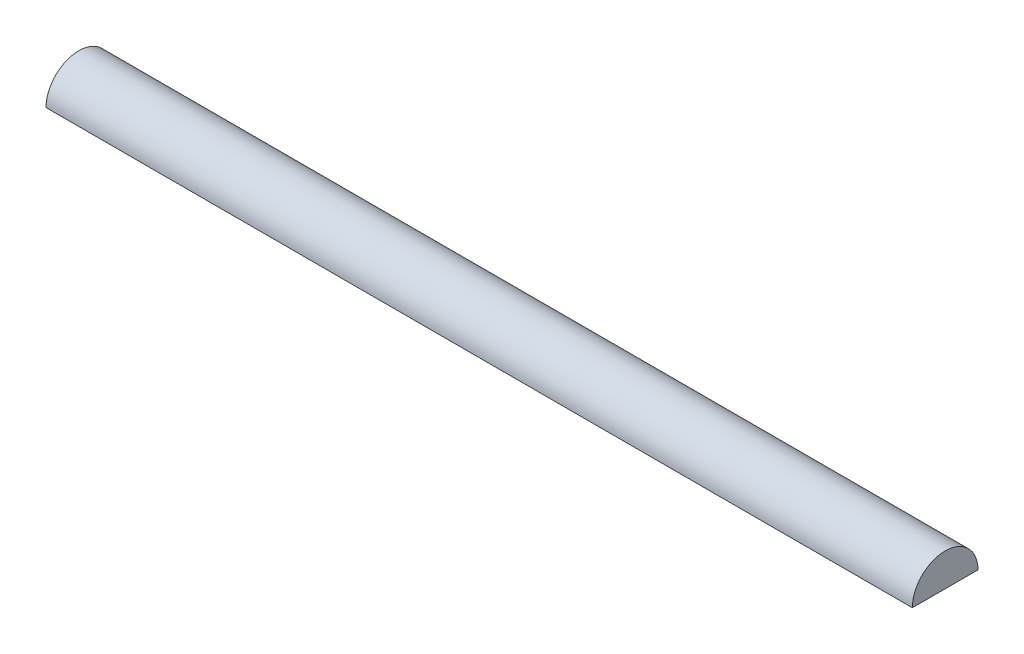
ISO-10303-21;
HEADER;
FILE_DESCRIPTION(('STEP AP214'),'2;1');
FILE_NAME('part.step','',(''),(''),'','','');
FILE_SCHEMA(('AUTOMOTIVE_DESIGN { 1 0 10303 214 1 1 1 1 }'));
ENDSEC;
DATA;
#1=APPLICATION_CONTEXT('core data for automotive mechanical design processes');
#2=APPLICATION_PROTOCOL_DEFINITION('international standard','automotive_design',2000,#1);
#3=PRODUCT_CONTEXT('',#1,'mechanical');
#4=PRODUCT('Part','Part','',(#3));
#5=PRODUCT_RELATED_PRODUCT_CATEGORY('part','',(#4));
#6=PRODUCT_DEFINITION_FORMATION('','',#4);
#7=PRODUCT_DEFINITION_CONTEXT('part definition',#1,'design');
#8=PRODUCT_DEFINITION('design','',#6,#7);
#9=PRODUCT_DEFINITION_SHAPE('','',#8);
#10=(LENGTH_UNIT() NAMED_UNIT(*) SI_UNIT(.MILLI.,.METRE.));
#11=(NAMED_UNIT(*) PLANE_ANGLE_UNIT() SI_UNIT($,.RADIAN.));
#12=(NAMED_UNIT(*) SI_UNIT($,.STERADIAN.) SOLID_ANGLE_UNIT());
#13=UNCERTAINTY_MEASURE_WITH_UNIT(LENGTH_MEASURE(1.E-05),#10,'distance_accuracy_value','');
#14=(GEOMETRIC_REPRESENTATION_CONTEXT(3) GLOBAL_UNCERTAINTY_ASSIGNED_CONTEXT((#13)) GLOBAL_UNIT_ASSIGNED_CONTEXT((#10,
#11,#12)) REPRESENTATION_CONTEXT('',''));
#15=CARTESIAN_POINT('',(0.,0.,0.));
#16=DIRECTION('',(0.,0.,1.));
#17=DIRECTION('',(1.,0.,0.));
#18=AXIS2_PLACEMENT_3D('',#15,#16,#17);
#19=CARTESIAN_POINT('',(-2679.16198120751,0.,0.));
#20=DIRECTION('',(1.,0.,0.));
#21=DIRECTION('',(0.,0.,-1.));
#22=AXIS2_PLACEMENT_3D('',#19,#20,#21);
#23=CYLINDRICAL_SURFACE('',#22,619.375942876971);
#24=DIRECTION('',(1.,0.,0.));
#25=VECTOR('',#24,1.);
#26=CARTESIAN_POINT('',(-2679.16198120751,0.,619.375942876971));
#27=LINE('',#26,#25);
#28=CARTESIAN_POINT('',(-6405.60888402492,0.,619.375942876972));
#29=VERTEX_POINT('',#28);
#30=CARTESIAN_POINT('',(-2668.01604934122,0.,619.375942876971));
#31=VERTEX_POINT('',#30);
#32=EDGE_CURVE('E156',#29,#31,#27,.T.);
#33=ORIENTED_EDGE('',*,*,#32,.F.);
#34=CARTESIAN_POINT('',(-6405.60888402492,0.,0.));
#35=DIRECTION('',(1.,0.,0.));
#36=DIRECTION('',(0.,0.,-1.));
#37=AXIS2_PLACEMENT_3D('',#34,#35,#36);
#38=CIRCLE('',#37,619.375942876972);
#39=CARTESIAN_POINT('',(-6405.60888402492,0.,-619.375942876972));
#40=VERTEX_POINT('',#39);
#41=EDGE_CURVE('E117',#40,#29,#38,.T.);
#42=ORIENTED_EDGE('',*,*,#41,.F.);
#43=DIRECTION('',(1.,0.,0.));
#44=VECTOR('',#43,1.);
#45=CARTESIAN_POINT('',(-2679.16198120751,0.,-619.375942876971));
#46=LINE('',#45,#44);
#47=CARTESIAN_POINT('',(-2668.01604934122,0.,-619.375942876971));
#48=VERTEX_POINT('',#47);
#49=EDGE_CURVE('E58',#48,#40,#46,.F.);
#50=ORIENTED_EDGE('',*,*,#49,.F.);
#51=CARTESIAN_POINT('',(-2668.01604934122,0.,0.));
#52=DIRECTION('',(1.,0.,0.));
#53=DIRECTION('',(0.,0.,-1.));
#54=AXIS2_PLACEMENT_3D('',#51,#52,#53);
#55=CIRCLE('',#54,619.375942876971);
#56=EDGE_CURVE('E130',#48,#31,#55,.T.);
#57=ORIENTED_EDGE('',*,*,#56,.T.);
#58=EDGE_LOOP('',(#33,#42,#50,#57));
#59=FACE_BOUND('',#58,.T.);
#60=ADVANCED_FACE('F35',(#59),#23,.F.);
#61=CARTESIAN_POINT('',(-2668.01604934122,0.,0.));
#62=DIRECTION('',(-1.,0.,0.));
#63=DIRECTION('',(0.,0.,1.));
#64=AXIS2_PLACEMENT_3D('',#61,#62,#63);
#65=CONICAL_SURFACE('',#64,619.375942876971,0.454109682678018);
#66=DIRECTION('',(-0.898651933027225,0.,-0.438662402385287));
#67=VECTOR('',#66,1.);
#68=CARTESIAN_POINT('',(-1399.15100572147,0.,0.));
#69=LINE('',#68,#67);
#70=CARTESIAN_POINT('',(-1757.1850452458,0.,-174.768523987243));
#71=VERTEX_POINT('',#70);
#72=EDGE_CURVE('E160',#71,#48,#69,.T.);
#73=ORIENTED_EDGE('',*,*,#72,.F.);
#74=CARTESIAN_POINT('',(-1757.1850452458,0.,0.));
#75=DIRECTION('',(1.,0.,0.));
#76=DIRECTION('',(0.,0.,-1.));
#77=AXIS2_PLACEMENT_3D('',#74,#75,#76);
#78=CIRCLE('',#77,174.768523987243);
#79=CARTESIAN_POINT('',(-1757.1850452458,0.,174.768523987243));
#80=VERTEX_POINT('',#79);
#81=EDGE_CURVE('E127',#71,#80,#78,.T.);
#82=ORIENTED_EDGE('',*,*,#81,.T.);
#83=DIRECTION('',(0.898651933027225,0.,-0.438662402385287));
#84=VECTOR('',#83,1.);
#85=CARTESIAN_POINT('',(-1399.15100572147,0.,0.));
#86=LINE('',#85,#84);
#87=EDGE_CURVE('E150',#31,#80,#86,.T.);
#88=ORIENTED_EDGE('',*,*,#87,.F.);
#89=ORIENTED_EDGE('',*,*,#56,.F.);
#90=EDGE_LOOP('',(#73,#82,#88,#89));
#91=FACE_BOUND('',#90,.T.);
#92=ADVANCED_FACE('F179',(#91),#65,.F.);
#93=CARTESIAN_POINT('',(-1757.1850452458,0.,0.));
#94=DIRECTION('',(-1.,0.,0.));
#95=DIRECTION('',(0.,0.,1.));
#96=AXIS2_PLACEMENT_3D('',#93,#94,#95);
#97=CONICAL_SURFACE('',#96,174.768523987243,0.18782042016647);
#98=DIRECTION('',(-0.982413535292082,0.,-0.186718091450492));
#99=VECTOR('',#98,1.);
#100=CARTESIAN_POINT('',(-837.643922185361,0.,0.));
#101=LINE('',#100,#99);
#102=CARTESIAN_POINT('',(-2679.16198120751,0.,-350.));
#103=VERTEX_POINT('',#102);
#104=EDGE_CURVE('E158',#103,#71,#101,.F.);
#105=ORIENTED_EDGE('',*,*,#104,.F.);
#106=CARTESIAN_POINT('',(-2679.16198120751,0.,0.));
#107=DIRECTION('',(1.,0.,0.));
#108=DIRECTION('',(0.,0.,-1.));
#109=AXIS2_PLACEMENT_3D('',#106,#107,#108);
#110=CIRCLE('',#109,350.);
#111=CARTESIAN_POINT('',(-2679.16198120751,0.,350.));
#112=VERTEX_POINT('',#111);
#113=EDGE_CURVE('E119',#103,#112,#110,.T.);
#114=ORIENTED_EDGE('',*,*,#113,.T.);
#115=DIRECTION('',(0.982413535292082,0.,-0.186718091450492));
#116=VECTOR('',#115,1.);
#117=CARTESIAN_POINT('',(-837.643922185361,0.,0.));
#118=LINE('',#117,#116);
#119=EDGE_CURVE('E152',#80,#112,#118,.F.);
#120=ORIENTED_EDGE('',*,*,#119,.F.);
#121=ORIENTED_EDGE('',*,*,#81,.F.);
#122=EDGE_LOOP('',(#105,#114,#120,#121));
#123=FACE_BOUND('',#122,.T.);
#124=ADVANCED_FACE('F175',(#123),#97,.T.);
#125=CARTESIAN_POINT('',(-2679.16198120751,0.,350.));
#126=DIRECTION('',(-1.,0.,0.));
#127=DIRECTION('',(0.,0.,1.));
#128=AXIS2_PLACEMENT_3D('',#125,#126,#127);
#129=PLANE('',#128);
#130=DIRECTION('',(0.,0.,-1.));
#131=VECTOR('',#130,1.);
#132=CARTESIAN_POINT('',(-2679.16198120751,0.,350.));
#133=LINE('',#132,#131);
#134=EDGE_CURVE('E154',#112,#103,#133,.T.);
#135=ORIENTED_EDGE('',*,*,#134,.F.);
#136=ORIENTED_EDGE('',*,*,#113,.F.);
#137=EDGE_LOOP('',(#135,#136));
#138=FACE_BOUND('',#137,.T.);
#139=ADVANCED_FACE('F168',(#138),#129,.T.);
#140=CARTESIAN_POINT('',(-5679.16198120751,0.,0.));
#141=DIRECTION('',(1.,0.,0.));
#142=DIRECTION('',(0.,0.,-1.));
#143=AXIS2_PLACEMENT_3D('',#140,#141,#142);
#144=PLANE('',#143);
#145=DIRECTION('',(0.,0.,1.));
#146=VECTOR('',#145,1.);
#147=CARTESIAN_POINT('',(-5679.16198120751,0.,0.));
#148=LINE('',#147,#146);
#149=CARTESIAN_POINT('',(-5679.16198120751,0.,-497.012889954442));
#150=VERTEX_POINT('',#149);
#151=CARTESIAN_POINT('',(-5679.16198120751,0.,497.012889954442));
#152=VERTEX_POINT('',#151);
#153=EDGE_CURVE('E113',#150,#152,#148,.T.);
#154=ORIENTED_EDGE('',*,*,#153,.F.);
#155=CARTESIAN_POINT('',(-5679.16198120751,0.,0.));
#156=DIRECTION('',(1.,0.,0.));
#157=DIRECTION('',(0.,0.,-1.));
#158=AXIS2_PLACEMENT_3D('',#155,#156,#157);
#159=CIRCLE('',#158,497.012889954442);
#160=EDGE_CURVE('E112',#150,#152,#159,.T.);
#161=ORIENTED_EDGE('',*,*,#160,.T.);
#162=EDGE_LOOP('',(#154,#161));
#163=FACE_BOUND('',#162,.T.);
#164=ADVANCED_FACE('F166',(#163),#144,.T.);
#165=CARTESIAN_POINT('',(-2679.16198120751,0.,0.));
#166=DIRECTION('',(1.,0.,0.));
#167=DIRECTION('',(0.,0.,-1.));
#168=AXIS2_PLACEMENT_3D('',#165,#166,#167);
#169=CYLINDRICAL_SURFACE('',#168,497.012889954442);
#170=DIRECTION('',(1.,0.,0.));
#171=VECTOR('',#170,1.);
#172=CARTESIAN_POINT('',(-2679.16198120751,0.,497.012889954442));
#173=LINE('',#172,#171);
#174=CARTESIAN_POINT('',(-6957.85106266087,0.,497.012889954442));
#175=VERTEX_POINT('',#174);
#176=EDGE_CURVE('E162',#152,#175,#173,.F.);
#177=ORIENTED_EDGE('',*,*,#176,.F.);
#178=ORIENTED_EDGE('',*,*,#160,.F.);
#179=DIRECTION('',(1.,0.,0.));
#180=VECTOR('',#179,1.);
#181=CARTESIAN_POINT('',(-2679.16198120751,0.,-497.012889954442));
#182=LINE('',#181,#180);
#183=CARTESIAN_POINT('',(-6957.85106266087,0.,-497.012889954442));
#184=VERTEX_POINT('',#183);
#185=EDGE_CURVE('E98',#184,#150,#182,.T.);
#186=ORIENTED_EDGE('',*,*,#185,.F.);
#187=CARTESIAN_POINT('',(-6957.85106266087,0.,0.));
#188=DIRECTION('',(1.,0.,0.));
#189=DIRECTION('',(0.,0.,-1.));
#190=AXIS2_PLACEMENT_3D('',#187,#188,#189);
#191=CIRCLE('',#190,497.012889954442);
#192=EDGE_CURVE('E110',#184,#175,#191,.T.);
#193=ORIENTED_EDGE('',*,*,#192,.T.);
#194=EDGE_LOOP('',(#177,#178,#186,#193));
#195=FACE_BOUND('',#194,.T.);
#196=ADVANCED_FACE('F109',(#195),#169,.T.);
#197=CARTESIAN_POINT('',(-6957.85106266087,0.,0.));
#198=DIRECTION('',(1.,0.,0.));
#199=DIRECTION('',(0.,0.,-1.));
#200=AXIS2_PLACEMENT_3D('',#197,#198,#199);
#201=CONICAL_SURFACE('',#200,497.012889954442,0.218052083223344);
#202=DIRECTION('',(0.976320690743557,0.,0.216328243246285));
#203=VECTOR('',#202,1.);
#204=CARTESIAN_POINT('',(-9200.94221316003,0.,0.));
#205=LINE('',#204,#203);
#206=EDGE_CURVE('E11',#175,#29,#205,.T.);
#207=ORIENTED_EDGE('',*,*,#206,.F.);
#208=ORIENTED_EDGE('',*,*,#192,.F.);
#209=DIRECTION('',(-0.976320690743557,0.,0.216328243246285));
#210=VECTOR('',#209,1.);
#211=CARTESIAN_POINT('',(-9200.94221316003,0.,0.));
#212=LINE('',#211,#210);
#213=EDGE_CURVE('E43',#40,#184,#212,.T.);
#214=ORIENTED_EDGE('',*,*,#213,.F.);
#215=ORIENTED_EDGE('',*,*,#41,.T.);
#216=EDGE_LOOP('',(#207,#208,#214,#215));
#217=FACE_BOUND('',#216,.T.);
#218=ADVANCED_FACE('F116',(#217),#201,.F.);
#219=CARTESIAN_POINT('',(0.,0.,0.));
#220=DIRECTION('',(0.,1.,0.));
#221=DIRECTION('',(0.,0.,1.));
#222=AXIS2_PLACEMENT_3D('',#219,#220,#221);
#223=PLANE('',#222);
#224=ORIENTED_EDGE('',*,*,#87,.T.);
#225=ORIENTED_EDGE('',*,*,#119,.T.);
#226=ORIENTED_EDGE('',*,*,#134,.T.);
#227=ORIENTED_EDGE('',*,*,#104,.T.);
#228=ORIENTED_EDGE('',*,*,#72,.T.);
#229=ORIENTED_EDGE('',*,*,#49,.T.);
#230=ORIENTED_EDGE('',*,*,#213,.T.);
#231=ORIENTED_EDGE('',*,*,#185,.T.);
#232=ORIENTED_EDGE('',*,*,#153,.T.);
#233=ORIENTED_EDGE('',*,*,#176,.T.);
#234=ORIENTED_EDGE('',*,*,#206,.T.);
#235=ORIENTED_EDGE('',*,*,#32,.T.);
#236=EDGE_LOOP('',(#224,#225,#226,#227,#228,#229,#230,#231,#232,#233,#234,#235));
#237=FACE_BOUND('',#236,.T.);
#238=DIRECTION('',(1.,0.,0.));
#239=VECTOR('',#238,1.);
#240=CARTESIAN_POINT('',(-15000.,0.,-757.997384020156));
#241=LINE('',#240,#239);
#242=CARTESIAN_POINT('',(-15000.,0.,-757.997384020156));
#243=VERTEX_POINT('',#242);
#244=CARTESIAN_POINT('',(5000.,0.,-757.997384020156));
#245=VERTEX_POINT('',#244);
#246=EDGE_CURVE('E50',#243,#245,#241,.T.);
#247=ORIENTED_EDGE('',*,*,#246,.T.);
#248=DIRECTION('',(0.,0.,1.));
#249=VECTOR('',#248,1.);
#250=CARTESIAN_POINT('',(5000.,0.,0.));
#251=LINE('',#250,#249);
#252=CARTESIAN_POINT('',(5000.,0.,757.997384020156));
#253=VERTEX_POINT('',#252);
#254=EDGE_CURVE('E148',#245,#253,#251,.T.);
#255=ORIENTED_EDGE('',*,*,#254,.T.);
#256=DIRECTION('',(1.,0.,0.));
#257=VECTOR('',#256,1.);
#258=CARTESIAN_POINT('',(-15000.,0.,757.997384020156));
#259=LINE('',#258,#257);
#260=CARTESIAN_POINT('',(-15000.,0.,757.997384020156));
#261=VERTEX_POINT('',#260);
#262=EDGE_CURVE('E141',#253,#261,#259,.F.);
#263=ORIENTED_EDGE('',*,*,#262,.T.);
#264=DIRECTION('',(0.,0.,1.));
#265=VECTOR('',#264,1.);
#266=CARTESIAN_POINT('',(-15000.,0.,0.));
#267=LINE('',#266,#265);
#268=EDGE_CURVE('E121',#243,#261,#267,.T.);
#269=ORIENTED_EDGE('',*,*,#268,.F.);
#270=EDGE_LOOP('',(#247,#255,#263,#269));
#271=FACE_BOUND('',#270,.T.);
#272=ADVANCED_FACE('F97',(#237,#271),#223,.F.);
#273=CARTESIAN_POINT('',(-15000.,0.,0.));
#274=DIRECTION('',(1.,0.,0.));
#275=DIRECTION('',(0.,0.,-1.));
#276=AXIS2_PLACEMENT_3D('',#273,#274,#275);
#277=CYLINDRICAL_SURFACE('',#276,757.997384020156);
#278=ORIENTED_EDGE('',*,*,#262,.F.);
#279=CARTESIAN_POINT('',(5000.,0.,0.));
#280=DIRECTION('',(1.,0.,0.));
#281=DIRECTION('',(0.,0.,-1.));
#282=AXIS2_PLACEMENT_3D('',#279,#280,#281);
#283=CIRCLE('',#282,757.997384020156);
#284=EDGE_CURVE('E133',#245,#253,#283,.T.);
#285=ORIENTED_EDGE('',*,*,#284,.F.);
#286=ORIENTED_EDGE('',*,*,#246,.F.);
#287=CARTESIAN_POINT('',(-15000.,0.,0.));
#288=DIRECTION('',(1.,0.,0.));
#289=DIRECTION('',(0.,0.,-1.));
#290=AXIS2_PLACEMENT_3D('',#287,#288,#289);
#291=CIRCLE('',#290,757.997384020156);
#292=EDGE_CURVE('E104',#243,#261,#291,.T.);
#293=ORIENTED_EDGE('',*,*,#292,.T.);
#294=EDGE_LOOP('',(#278,#285,#286,#293));
#295=FACE_BOUND('',#294,.T.);
#296=ADVANCED_FACE('F37',(#295),#277,.T.);
#297=CARTESIAN_POINT('',(-15000.,0.,0.));
#298=DIRECTION('',(1.,0.,0.));
#299=DIRECTION('',(0.,0.,-1.));
#300=AXIS2_PLACEMENT_3D('',#297,#298,#299);
#301=PLANE('',#300);
#302=ORIENTED_EDGE('',*,*,#292,.F.);
#303=ORIENTED_EDGE('',*,*,#268,.T.);
#304=EDGE_LOOP('',(#302,#303));
#305=FACE_BOUND('',#304,.T.);
#306=ADVANCED_FACE('F144',(#305),#301,.F.);
#307=CARTESIAN_POINT('',(5000.,0.,0.));
#308=DIRECTION('',(1.,0.,0.));
#309=DIRECTION('',(0.,0.,-1.));
#310=AXIS2_PLACEMENT_3D('',#307,#308,#309);
#311=PLANE('',#310);
#312=ORIENTED_EDGE('',*,*,#254,.F.);
#313=ORIENTED_EDGE('',*,*,#284,.T.);
#314=EDGE_LOOP('',(#312,#313));
#315=FACE_BOUND('',#314,.T.);
#316=ADVANCED_FACE('F190',(#315),#311,.T.);
#317=CLOSED_SHELL('',(#60,#92,#124,#139,#164,#196,#218,#272,#296,#306,#316));
#318=MANIFOLD_SOLID_BREP('B2',#317);
#319=ADVANCED_BREP_SHAPE_REPRESENTATION('',(#18,#318),#14);
#320=SHAPE_DEFINITION_REPRESENTATION(#9,#319);
ENDSEC;
END-ISO-10303-21;
